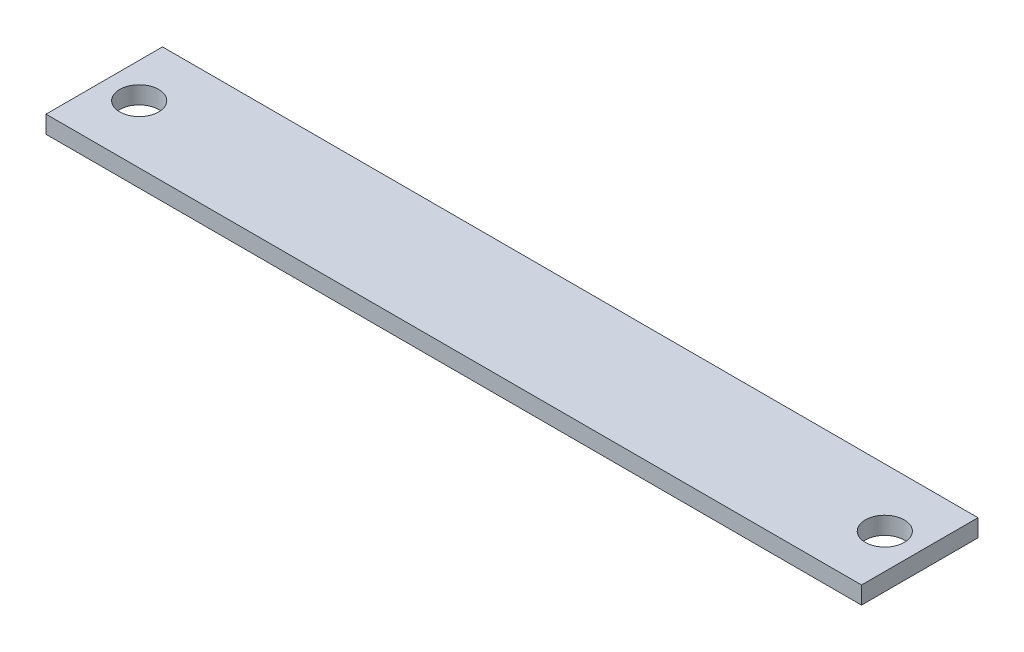
ISO-10303-21;
HEADER;
FILE_DESCRIPTION(('STEP AP214'),'2;1');
FILE_NAME('part.step','',(''),(''),'','','');
FILE_SCHEMA(('AUTOMOTIVE_DESIGN { 1 0 10303 214 1 1 1 1 }'));
ENDSEC;
DATA;
#1=APPLICATION_CONTEXT('core data for automotive mechanical design processes');
#2=APPLICATION_PROTOCOL_DEFINITION('international standard','automotive_design',2000,#1);
#3=PRODUCT_CONTEXT('',#1,'mechanical');
#4=PRODUCT('Part','Part','',(#3));
#5=PRODUCT_RELATED_PRODUCT_CATEGORY('part','',(#4));
#6=PRODUCT_DEFINITION_FORMATION('','',#4);
#7=PRODUCT_DEFINITION_CONTEXT('part definition',#1,'design');
#8=PRODUCT_DEFINITION('design','',#6,#7);
#9=PRODUCT_DEFINITION_SHAPE('','',#8);
#10=(LENGTH_UNIT() NAMED_UNIT(*) SI_UNIT(.MILLI.,.METRE.));
#11=(NAMED_UNIT(*) PLANE_ANGLE_UNIT() SI_UNIT($,.RADIAN.));
#12=(NAMED_UNIT(*) SI_UNIT($,.STERADIAN.) SOLID_ANGLE_UNIT());
#13=UNCERTAINTY_MEASURE_WITH_UNIT(LENGTH_MEASURE(1.E-05),#10,'distance_accuracy_value','');
#14=(GEOMETRIC_REPRESENTATION_CONTEXT(3) GLOBAL_UNCERTAINTY_ASSIGNED_CONTEXT((#13)) GLOBAL_UNIT_ASSIGNED_CONTEXT((#10,
#11,#12)) REPRESENTATION_CONTEXT('',''));
#15=CARTESIAN_POINT('',(0.,0.,0.));
#16=DIRECTION('',(0.,0.,1.));
#17=DIRECTION('',(1.,0.,0.));
#18=AXIS2_PLACEMENT_3D('',#15,#16,#17);
#19=CARTESIAN_POINT('',(0.,3.,0.));
#20=DIRECTION('',(0.,1.,0.));
#21=DIRECTION('',(0.,0.,1.));
#22=AXIS2_PLACEMENT_3D('',#19,#20,#21);
#23=PLANE('',#22);
#24=CARTESIAN_POINT('',(-98.5021645021645,3.,-11.038961038961));
#25=DIRECTION('',(0.,1.,0.));
#26=DIRECTION('',(0.,0.,1.));
#27=AXIS2_PLACEMENT_3D('',#24,#25,#26);
#28=CIRCLE('',#27,3.35);
#29=CARTESIAN_POINT('',(-98.5021645021645,3.,-7.68896103896102));
#30=VERTEX_POINT('',#29);
#31=EDGE_CURVE('E118',#30,#30,#28,.T.);
#32=ORIENTED_EDGE('',*,*,#31,.F.);
#33=EDGE_LOOP('',(#32));
#34=FACE_BOUND('',#33,.T.);
#35=DIRECTION('',(0.,0.,1.));
#36=VECTOR('',#35,1.);
#37=CARTESIAN_POINT('',(-104.502164502165,3.,-21.038961038961));
#38=LINE('',#37,#36);
#39=CARTESIAN_POINT('',(-104.502164502165,3.,-21.038961038961));
#40=VERTEX_POINT('',#39);
#41=CARTESIAN_POINT('',(-104.502164502165,3.,-1.03896103896103));
#42=VERTEX_POINT('',#41);
#43=EDGE_CURVE('E98',#40,#42,#38,.T.);
#44=ORIENTED_EDGE('',*,*,#43,.T.);
#45=DIRECTION('',(1.,0.,0.));
#46=VECTOR('',#45,1.);
#47=CARTESIAN_POINT('',(-104.502164502165,3.,-1.03896103896103));
#48=LINE('',#47,#46);
#49=CARTESIAN_POINT('',(35.4978354978355,3.,-1.03896103896103));
#50=VERTEX_POINT('',#49);
#51=EDGE_CURVE('E93',#42,#50,#48,.T.);
#52=ORIENTED_EDGE('',*,*,#51,.T.);
#53=DIRECTION('',(0.,0.,-1.));
#54=VECTOR('',#53,1.);
#55=CARTESIAN_POINT('',(35.4978354978355,3.,-21.038961038961));
#56=LINE('',#55,#54);
#57=CARTESIAN_POINT('',(35.4978354978355,3.,-21.038961038961));
#58=VERTEX_POINT('',#57);
#59=EDGE_CURVE('E96',#50,#58,#56,.T.);
#60=ORIENTED_EDGE('',*,*,#59,.T.);
#61=DIRECTION('',(-1.,0.,0.));
#62=VECTOR('',#61,1.);
#63=CARTESIAN_POINT('',(-104.502164502165,3.,-21.038961038961));
#64=LINE('',#63,#62);
#65=EDGE_CURVE('E63',#58,#40,#64,.T.);
#66=ORIENTED_EDGE('',*,*,#65,.T.);
#67=EDGE_LOOP('',(#44,#52,#60,#66));
#68=FACE_BOUND('',#67,.T.);
#69=CARTESIAN_POINT('',(29.4978354978355,3.,-11.038961038961));
#70=DIRECTION('',(0.,1.,0.));
#71=DIRECTION('',(0.,0.,1.));
#72=AXIS2_PLACEMENT_3D('',#69,#70,#71);
#73=CIRCLE('',#72,3.35);
#74=CARTESIAN_POINT('',(29.4978354978355,3.,-7.68896103896102));
#75=VERTEX_POINT('',#74);
#76=EDGE_CURVE('E140',#75,#75,#73,.T.);
#77=ORIENTED_EDGE('',*,*,#76,.F.);
#78=EDGE_LOOP('',(#77));
#79=FACE_BOUND('',#78,.T.);
#80=ADVANCED_FACE('F45',(#34,#68,#79),#23,.T.);
#81=CARTESIAN_POINT('',(0.,0.,0.));
#82=DIRECTION('',(0.,1.,0.));
#83=DIRECTION('',(0.,0.,1.));
#84=AXIS2_PLACEMENT_3D('',#81,#82,#83);
#85=PLANE('',#84);
#86=DIRECTION('',(0.,0.,1.));
#87=VECTOR('',#86,1.);
#88=CARTESIAN_POINT('',(-104.502164502165,0.,-21.038961038961));
#89=LINE('',#88,#87);
#90=CARTESIAN_POINT('',(-104.502164502165,0.,-21.038961038961));
#91=VERTEX_POINT('',#90);
#92=CARTESIAN_POINT('',(-104.502164502165,0.,-1.03896103896103));
#93=VERTEX_POINT('',#92);
#94=EDGE_CURVE('E114',#91,#93,#89,.T.);
#95=ORIENTED_EDGE('',*,*,#94,.F.);
#96=DIRECTION('',(-1.,0.,0.));
#97=VECTOR('',#96,1.);
#98=CARTESIAN_POINT('',(-104.502164502165,0.,-21.038961038961));
#99=LINE('',#98,#97);
#100=CARTESIAN_POINT('',(35.4978354978355,0.,-21.038961038961));
#101=VERTEX_POINT('',#100);
#102=EDGE_CURVE('E86',#101,#91,#99,.T.);
#103=ORIENTED_EDGE('',*,*,#102,.F.);
#104=DIRECTION('',(0.,0.,-1.));
#105=VECTOR('',#104,1.);
#106=CARTESIAN_POINT('',(35.4978354978355,0.,-21.038961038961));
#107=LINE('',#106,#105);
#108=CARTESIAN_POINT('',(35.4978354978355,0.,-1.03896103896103));
#109=VERTEX_POINT('',#108);
#110=EDGE_CURVE('E80',#109,#101,#107,.T.);
#111=ORIENTED_EDGE('',*,*,#110,.F.);
#112=DIRECTION('',(1.,0.,0.));
#113=VECTOR('',#112,1.);
#114=CARTESIAN_POINT('',(-104.502164502165,0.,-1.03896103896103));
#115=LINE('',#114,#113);
#116=EDGE_CURVE('E103',#93,#109,#115,.T.);
#117=ORIENTED_EDGE('',*,*,#116,.F.);
#118=EDGE_LOOP('',(#95,#103,#111,#117));
#119=FACE_BOUND('',#118,.T.);
#120=CARTESIAN_POINT('',(-98.5021645021645,0.,-11.038961038961));
#121=DIRECTION('',(0.,1.,0.));
#122=DIRECTION('',(0.,0.,1.));
#123=AXIS2_PLACEMENT_3D('',#120,#121,#122);
#124=CIRCLE('',#123,3.35);
#125=CARTESIAN_POINT('',(-98.5021645021645,0.,-7.68896103896102));
#126=VERTEX_POINT('',#125);
#127=EDGE_CURVE('E136',#126,#126,#124,.T.);
#128=ORIENTED_EDGE('',*,*,#127,.T.);
#129=EDGE_LOOP('',(#128));
#130=FACE_BOUND('',#129,.T.);
#131=CARTESIAN_POINT('',(29.4978354978355,0.,-11.038961038961));
#132=DIRECTION('',(0.,1.,0.));
#133=DIRECTION('',(0.,0.,1.));
#134=AXIS2_PLACEMENT_3D('',#131,#132,#133);
#135=CIRCLE('',#134,3.35);
#136=CARTESIAN_POINT('',(29.4978354978355,0.,-7.68896103896102));
#137=VERTEX_POINT('',#136);
#138=EDGE_CURVE('E144',#137,#137,#135,.T.);
#139=ORIENTED_EDGE('',*,*,#138,.T.);
#140=EDGE_LOOP('',(#139));
#141=FACE_BOUND('',#140,.T.);
#142=ADVANCED_FACE('F131',(#119,#130,#141),#85,.F.);
#143=CARTESIAN_POINT('',(-104.502164502165,3.,-21.038961038961));
#144=DIRECTION('',(1.,0.,0.));
#145=DIRECTION('',(0.,0.,-1.));
#146=AXIS2_PLACEMENT_3D('',#143,#144,#145);
#147=PLANE('',#146);
#148=ORIENTED_EDGE('',*,*,#94,.T.);
#149=DIRECTION('',(0.,-1.,0.));
#150=VECTOR('',#149,1.);
#151=CARTESIAN_POINT('',(-104.502164502165,3.,-1.03896103896103));
#152=LINE('',#151,#150);
#153=EDGE_CURVE('E11',#42,#93,#152,.T.);
#154=ORIENTED_EDGE('',*,*,#153,.F.);
#155=ORIENTED_EDGE('',*,*,#43,.F.);
#156=DIRECTION('',(0.,-1.,0.));
#157=VECTOR('',#156,1.);
#158=CARTESIAN_POINT('',(-104.502164502165,3.,-21.038961038961));
#159=LINE('',#158,#157);
#160=EDGE_CURVE('E110',#40,#91,#159,.T.);
#161=ORIENTED_EDGE('',*,*,#160,.T.);
#162=EDGE_LOOP('',(#148,#154,#155,#161));
#163=FACE_BOUND('',#162,.T.);
#164=ADVANCED_FACE('F47',(#163),#147,.F.);
#165=CARTESIAN_POINT('',(-104.502164502165,3.,-1.03896103896103));
#166=DIRECTION('',(0.,0.,-1.));
#167=DIRECTION('',(-1.,0.,0.));
#168=AXIS2_PLACEMENT_3D('',#165,#166,#167);
#169=PLANE('',#168);
#170=ORIENTED_EDGE('',*,*,#116,.T.);
#171=DIRECTION('',(0.,-1.,0.));
#172=VECTOR('',#171,1.);
#173=CARTESIAN_POINT('',(35.4978354978355,3.,-1.03896103896103));
#174=LINE('',#173,#172);
#175=EDGE_CURVE('E55',#50,#109,#174,.T.);
#176=ORIENTED_EDGE('',*,*,#175,.F.);
#177=ORIENTED_EDGE('',*,*,#51,.F.);
#178=ORIENTED_EDGE('',*,*,#153,.T.);
#179=EDGE_LOOP('',(#170,#176,#177,#178));
#180=FACE_BOUND('',#179,.T.);
#181=ADVANCED_FACE('F102',(#180),#169,.F.);
#182=CARTESIAN_POINT('',(35.4978354978355,3.,-21.038961038961));
#183=DIRECTION('',(-1.,0.,0.));
#184=DIRECTION('',(0.,0.,1.));
#185=AXIS2_PLACEMENT_3D('',#182,#183,#184);
#186=PLANE('',#185);
#187=ORIENTED_EDGE('',*,*,#110,.T.);
#188=DIRECTION('',(0.,-1.,0.));
#189=VECTOR('',#188,1.);
#190=CARTESIAN_POINT('',(35.4978354978355,3.,-21.038961038961));
#191=LINE('',#190,#189);
#192=EDGE_CURVE('E105',#58,#101,#191,.T.);
#193=ORIENTED_EDGE('',*,*,#192,.F.);
#194=ORIENTED_EDGE('',*,*,#59,.F.);
#195=ORIENTED_EDGE('',*,*,#175,.T.);
#196=EDGE_LOOP('',(#187,#193,#194,#195));
#197=FACE_BOUND('',#196,.T.);
#198=ADVANCED_FACE('F106',(#197),#186,.F.);
#199=CARTESIAN_POINT('',(-104.502164502165,3.,-21.038961038961));
#200=DIRECTION('',(0.,0.,1.));
#201=DIRECTION('',(1.,0.,0.));
#202=AXIS2_PLACEMENT_3D('',#199,#200,#201);
#203=PLANE('',#202);
#204=ORIENTED_EDGE('',*,*,#102,.T.);
#205=ORIENTED_EDGE('',*,*,#160,.F.);
#206=ORIENTED_EDGE('',*,*,#65,.F.);
#207=ORIENTED_EDGE('',*,*,#192,.T.);
#208=EDGE_LOOP('',(#204,#205,#206,#207));
#209=FACE_BOUND('',#208,.T.);
#210=ADVANCED_FACE('F128',(#209),#203,.F.);
#211=CARTESIAN_POINT('',(-98.5021645021645,3.,-11.038961038961));
#212=DIRECTION('',(0.,-1.,0.));
#213=DIRECTION('',(0.,0.,-1.));
#214=AXIS2_PLACEMENT_3D('',#211,#212,#213);
#215=CYLINDRICAL_SURFACE('',#214,3.35);
#216=ORIENTED_EDGE('',*,*,#31,.T.);
#217=EDGE_LOOP('',(#216));
#218=FACE_BOUND('',#217,.T.);
#219=ORIENTED_EDGE('',*,*,#127,.F.);
#220=EDGE_LOOP('',(#219));
#221=FACE_BOUND('',#220,.T.);
#222=ADVANCED_FACE('F163',(#218,#221),#215,.F.);
#223=CARTESIAN_POINT('',(29.4978354978355,3.,-11.038961038961));
#224=DIRECTION('',(0.,-1.,0.));
#225=DIRECTION('',(0.,0.,-1.));
#226=AXIS2_PLACEMENT_3D('',#223,#224,#225);
#227=CYLINDRICAL_SURFACE('',#226,3.35);
#228=ORIENTED_EDGE('',*,*,#76,.T.);
#229=EDGE_LOOP('',(#228));
#230=FACE_BOUND('',#229,.T.);
#231=ORIENTED_EDGE('',*,*,#138,.F.);
#232=EDGE_LOOP('',(#231));
#233=FACE_BOUND('',#232,.T.);
#234=ADVANCED_FACE('F152',(#230,#233),#227,.F.);
#235=CLOSED_SHELL('',(#80,#142,#164,#181,#198,#210,#222,#234));
#236=MANIFOLD_SOLID_BREP('B2',#235);
#237=ADVANCED_BREP_SHAPE_REPRESENTATION('',(#18,#236),#14);
#238=SHAPE_DEFINITION_REPRESENTATION(#9,#237);
ENDSEC;
END-ISO-10303-21;
